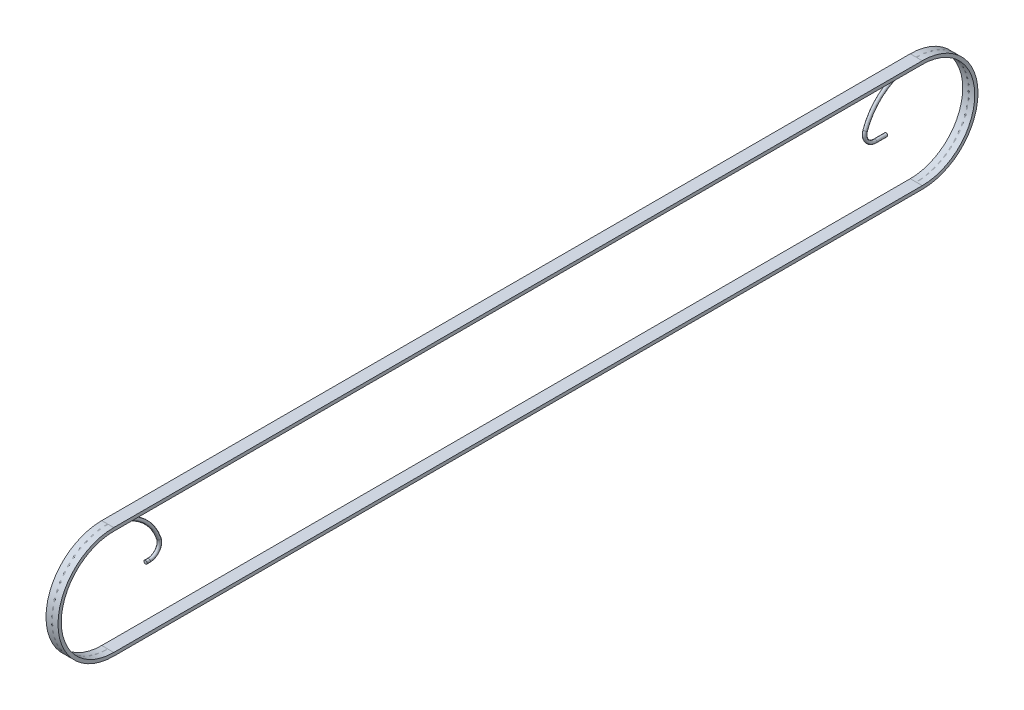
ISO-10303-21;
HEADER;
FILE_DESCRIPTION(('STEP AP214'),'2;1');
FILE_NAME('part.step','',(''),(''),'','','');
FILE_SCHEMA(('AUTOMOTIVE_DESIGN { 1 0 10303 214 1 1 1 1 }'));
ENDSEC;
DATA;
#1=APPLICATION_CONTEXT('core data for automotive mechanical design processes');
#2=APPLICATION_PROTOCOL_DEFINITION('international standard','automotive_design',2000,#1);
#3=PRODUCT_CONTEXT('',#1,'mechanical');
#4=PRODUCT('Part','Part','',(#3));
#5=PRODUCT_RELATED_PRODUCT_CATEGORY('part','',(#4));
#6=PRODUCT_DEFINITION_FORMATION('','',#4);
#7=PRODUCT_DEFINITION_CONTEXT('part definition',#1,'design');
#8=PRODUCT_DEFINITION('design','',#6,#7);
#9=PRODUCT_DEFINITION_SHAPE('','',#8);
#10=(LENGTH_UNIT() NAMED_UNIT(*) SI_UNIT(.MILLI.,.METRE.));
#11=(NAMED_UNIT(*) PLANE_ANGLE_UNIT() SI_UNIT($,.RADIAN.));
#12=(NAMED_UNIT(*) SI_UNIT($,.STERADIAN.) SOLID_ANGLE_UNIT());
#13=UNCERTAINTY_MEASURE_WITH_UNIT(LENGTH_MEASURE(1.E-05),#10,'distance_accuracy_value','');
#14=(GEOMETRIC_REPRESENTATION_CONTEXT(3) GLOBAL_UNCERTAINTY_ASSIGNED_CONTEXT((#13)) GLOBAL_UNIT_ASSIGNED_CONTEXT((#10,
#11,#12)) REPRESENTATION_CONTEXT('',''));
#15=CARTESIAN_POINT('',(0.,0.,0.));
#16=DIRECTION('',(0.,0.,1.));
#17=DIRECTION('',(1.,0.,0.));
#18=AXIS2_PLACEMENT_3D('',#15,#16,#17);
#19=CARTESIAN_POINT('',(0.,5.55624999999999,-54.8438443036897));
#20=DIRECTION('',(0.,0.,-1.));
#21=DIRECTION('',(-1.,0.,0.));
#22=AXIS2_PLACEMENT_3D('',#19,#20,#21);
#23=PLANE('',#22);
#24=CARTESIAN_POINT('',(0.,5.55624999999999,-54.8438443036897));
#25=DIRECTION('',(0.,0.,-1.));
#26=DIRECTION('',(-1.,0.,0.));
#27=AXIS2_PLACEMENT_3D('',#24,#25,#26);
#28=CIRCLE('',#27,2.38125);
#29=CARTESIAN_POINT('',(-2.38125,5.55624999999999,-54.8438443036897));
#30=VERTEX_POINT('',#29);
#31=EDGE_CURVE('E75',#30,#30,#28,.T.);
#32=ORIENTED_EDGE('',*,*,#31,.F.);
#33=EDGE_LOOP('',(#32));
#34=FACE_BOUND('',#33,.T.);
#35=ADVANCED_FACE('F63',(#34),#23,.F.);
#36=CARTESIAN_POINT('',(0.,5.55625,-1130.87336033031));
#37=DIRECTION('',(0.,0.,-1.));
#38=DIRECTION('',(-1.,0.,0.));
#39=AXIS2_PLACEMENT_3D('',#36,#37,#38);
#40=PLANE('',#39);
#41=CARTESIAN_POINT('',(0.,5.55625,-1130.87336033031));
#42=DIRECTION('',(0.,0.,-1.));
#43=DIRECTION('',(-1.,0.,0.));
#44=AXIS2_PLACEMENT_3D('',#41,#42,#43);
#45=CIRCLE('',#44,2.38125);
#46=CARTESIAN_POINT('',(-2.38125,5.55625,-1130.87336033031));
#47=VERTEX_POINT('',#46);
#48=EDGE_CURVE('E13',#47,#47,#45,.T.);
#49=ORIENTED_EDGE('',*,*,#48,.T.);
#50=EDGE_LOOP('',(#49));
#51=FACE_BOUND('',#50,.T.);
#52=ADVANCED_FACE('F78',(#51),#40,.T.);
#53=CARTESIAN_POINT('',(0.,5.55624999999999,-54.8438443036897));
#54=DIRECTION('',(0.,0.,-1.));
#55=DIRECTION('',(0.,1.,0.));
#56=AXIS2_PLACEMENT_3D('',#53,#54,#55);
#57=CYLINDRICAL_SURFACE('',#56,2.38125);
#58=CARTESIAN_POINT('',(0.,5.55625,-59.6063443036897));
#59=DIRECTION('',(0.,0.,-1.));
#60=DIRECTION('',(-1.,0.,0.));
#61=AXIS2_PLACEMENT_3D('',#58,#59,#60);
#62=CIRCLE('',#61,2.38125);
#63=CARTESIAN_POINT('',(0.,3.17499999999997,-59.6063443036897));
#64=VERTEX_POINT('',#63);
#65=EDGE_CURVE('E101',#64,#64,#62,.T.);
#66=ORIENTED_EDGE('',*,*,#65,.F.);
#67=EDGE_LOOP('',(#66));
#68=FACE_BOUND('',#67,.T.);
#69=ORIENTED_EDGE('',*,*,#31,.T.);
#70=EDGE_LOOP('',(#69));
#71=FACE_BOUND('',#70,.T.);
#72=ADVANCED_FACE('F105',(#68,#71),#57,.T.);
#73=CARTESIAN_POINT('',(0.,20.955,-59.6063443036897));
#74=DIRECTION('',(1.,0.,0.));
#75=DIRECTION('',(0.,0.,-1.));
#76=AXIS2_PLACEMENT_3D('',#73,#74,#75);
#77=TOROIDAL_SURFACE('',#76,15.39875,2.38125);
#78=CARTESIAN_POINT('',(0.,26.0621231155779,-74.1335186691618));
#79=DIRECTION('',(0.,0.943399585386613,0.331658291457286));
#80=DIRECTION('',(-1.,0.,0.));
#81=AXIS2_PLACEMENT_3D('',#78,#79,#80);
#82=CIRCLE('',#81,2.38125);
#83=CARTESIAN_POINT('',(0.,26.8518844221106,-76.3799889318637));
#84=VERTEX_POINT('',#83);
#85=EDGE_CURVE('E98',#84,#84,#82,.T.);
#86=CARTESIAN_POINT('',(0.,20.955,-59.6063443036897));
#87=DIRECTION('',(1.,0.,0.));
#88=DIRECTION('',(0.,0.,-1.));
#89=AXIS2_PLACEMENT_3D('',#86,#87,#88);
#90=CIRCLE('',#89,17.78);
#91=EDGE_CURVE('',#64,#84,#90,.T.);
#92=ORIENTED_EDGE('',*,*,#65,.T.);
#93=ORIENTED_EDGE('',*,*,#85,.F.);
#94=ORIENTED_EDGE('',*,*,#91,.T.);
#95=ORIENTED_EDGE('',*,*,#91,.F.);
#96=EDGE_LOOP('',(#92,#94,#93,#95));
#97=FACE_BOUND('',#96,.T.);
#98=ADVANCED_FACE('F107',(#97),#77,.T.);
#99=CARTESIAN_POINT('',(0.,0.,0.));
#100=DIRECTION('',(1.,0.,0.));
#101=DIRECTION('',(0.,0.,-1.));
#102=AXIS2_PLACEMENT_3D('',#99,#100,#101);
#103=TOROIDAL_SURFACE('',#102,78.58125,2.38125);
#104=CARTESIAN_POINT('',(0.,-78.58125,0.));
#105=DIRECTION('',(0.,0.,-1.));
#106=DIRECTION('',(-1.,0.,0.));
#107=AXIS2_PLACEMENT_3D('',#104,#105,#106);
#108=CIRCLE('',#107,2.38125);
#109=CARTESIAN_POINT('',(0.,-80.9625,0.));
#110=VERTEX_POINT('',#109);
#111=EDGE_CURVE('E95',#110,#110,#108,.T.);
#112=CARTESIAN_POINT('',(0.,0.,0.));
#113=DIRECTION('',(1.,0.,0.));
#114=DIRECTION('',(0.,0.,-1.));
#115=AXIS2_PLACEMENT_3D('',#112,#113,#114);
#116=CIRCLE('',#115,80.9625);
#117=EDGE_CURVE('',#84,#110,#116,.T.);
#118=ORIENTED_EDGE('',*,*,#85,.T.);
#119=ORIENTED_EDGE('',*,*,#111,.F.);
#120=ORIENTED_EDGE('',*,*,#117,.T.);
#121=ORIENTED_EDGE('',*,*,#117,.F.);
#122=EDGE_LOOP('',(#118,#120,#119,#121));
#123=FACE_BOUND('',#122,.T.);
#124=ADVANCED_FACE('F114',(#123),#103,.T.);
#125=CARTESIAN_POINT('',(0.,-78.58125,0.));
#126=DIRECTION('',(0.,0.,-1.));
#127=DIRECTION('',(-1.,0.,0.));
#128=AXIS2_PLACEMENT_3D('',#125,#126,#127);
#129=CYLINDRICAL_SURFACE('',#128,2.38125);
#130=CARTESIAN_POINT('',(0.,-78.58125,-1174.668204634));
#131=DIRECTION('',(0.,0.,-1.));
#132=DIRECTION('',(-1.,0.,0.));
#133=AXIS2_PLACEMENT_3D('',#130,#131,#132);
#134=CIRCLE('',#133,2.38125);
#135=CARTESIAN_POINT('',(0.,-80.9625,-1174.668204634));
#136=VERTEX_POINT('',#135);
#137=EDGE_CURVE('E90',#136,#136,#134,.T.);
#138=ORIENTED_EDGE('',*,*,#137,.F.);
#139=EDGE_LOOP('',(#138));
#140=FACE_BOUND('',#139,.T.);
#141=ORIENTED_EDGE('',*,*,#111,.T.);
#142=EDGE_LOOP('',(#141));
#143=FACE_BOUND('',#142,.T.);
#144=ADVANCED_FACE('F121',(#140,#143),#129,.T.);
#145=CARTESIAN_POINT('',(0.,0.,-1174.668204634));
#146=DIRECTION('',(1.,0.,0.));
#147=DIRECTION('',(0.,0.,-1.));
#148=AXIS2_PLACEMENT_3D('',#145,#146,#147);
#149=TOROIDAL_SURFACE('',#148,78.58125,2.38125);
#150=CARTESIAN_POINT('',(0.,26.0621231155778,-1100.53468596484));
#151=DIRECTION('',(0.,-0.943399585386614,0.331658291457286));
#152=DIRECTION('',(-1.,0.,0.));
#153=AXIS2_PLACEMENT_3D('',#150,#151,#152);
#154=CIRCLE('',#153,2.38125);
#155=CARTESIAN_POINT('',(0.,26.8518844221104,-1098.28821570214));
#156=VERTEX_POINT('',#155);
#157=EDGE_CURVE('E88',#156,#156,#154,.T.);
#158=CARTESIAN_POINT('',(0.,0.,-1174.668204634));
#159=DIRECTION('',(1.,0.,0.));
#160=DIRECTION('',(0.,0.,-1.));
#161=AXIS2_PLACEMENT_3D('',#158,#159,#160);
#162=CIRCLE('',#161,80.9625);
#163=EDGE_CURVE('',#136,#156,#162,.T.);
#164=ORIENTED_EDGE('',*,*,#137,.T.);
#165=ORIENTED_EDGE('',*,*,#157,.F.);
#166=ORIENTED_EDGE('',*,*,#163,.T.);
#167=ORIENTED_EDGE('',*,*,#163,.F.);
#168=EDGE_LOOP('',(#164,#166,#165,#167));
#169=FACE_BOUND('',#168,.T.);
#170=ADVANCED_FACE('F125',(#169),#149,.T.);
#171=CARTESIAN_POINT('',(0.,20.955,-1115.06186033031));
#172=DIRECTION('',(1.,0.,0.));
#173=DIRECTION('',(0.,0.,-1.));
#174=AXIS2_PLACEMENT_3D('',#171,#172,#173);
#175=TOROIDAL_SURFACE('',#174,15.3987500000001,2.38125);
#176=CARTESIAN_POINT('',(0.,5.55624999999995,-1115.06186033031));
#177=DIRECTION('',(0.,0.,-1.));
#178=DIRECTION('',(-1.,0.,0.));
#179=AXIS2_PLACEMENT_3D('',#176,#177,#178);
#180=CIRCLE('',#179,2.38125);
#181=CARTESIAN_POINT('',(0.,3.17499999999988,-1115.06186033031));
#182=VERTEX_POINT('',#181);
#183=EDGE_CURVE('E70',#182,#182,#180,.T.);
#184=CARTESIAN_POINT('',(0.,20.955,-1115.06186033031));
#185=DIRECTION('',(1.,0.,0.));
#186=DIRECTION('',(0.,0.,-1.));
#187=AXIS2_PLACEMENT_3D('',#184,#185,#186);
#188=CIRCLE('',#187,17.7800000000001);
#189=EDGE_CURVE('',#156,#182,#188,.T.);
#190=ORIENTED_EDGE('',*,*,#157,.T.);
#191=ORIENTED_EDGE('',*,*,#183,.F.);
#192=ORIENTED_EDGE('',*,*,#189,.T.);
#193=ORIENTED_EDGE('',*,*,#189,.F.);
#194=EDGE_LOOP('',(#190,#192,#191,#193));
#195=FACE_BOUND('',#194,.T.);
#196=ADVANCED_FACE('F83',(#195),#175,.T.);
#197=CARTESIAN_POINT('',(0.,5.55625,-1115.06186033031));
#198=DIRECTION('',(0.,0.,-1.));
#199=DIRECTION('',(0.,1.,0.));
#200=AXIS2_PLACEMENT_3D('',#197,#198,#199);
#201=CYLINDRICAL_SURFACE('',#200,2.38125);
#202=ORIENTED_EDGE('',*,*,#48,.F.);
#203=EDGE_LOOP('',(#202));
#204=FACE_BOUND('',#203,.T.);
#205=ORIENTED_EDGE('',*,*,#183,.T.);
#206=EDGE_LOOP('',(#205));
#207=FACE_BOUND('',#206,.T.);
#208=ADVANCED_FACE('F80',(#204,#207),#201,.T.);
#209=CLOSED_SHELL('',(#35,#52,#72,#98,#124,#144,#170,#196,#208));
#210=MANIFOLD_SOLID_BREP('B2',#209);
#211=CARTESIAN_POINT('',(8.73125,0.,0.));
#212=DIRECTION('',(1.,0.,0.));
#213=DIRECTION('',(0.,0.,-1.));
#214=AXIS2_PLACEMENT_3D('',#211,#212,#213);
#215=PLANE('',#214);
#216=CARTESIAN_POINT('',(8.73125,0.,0.));
#217=DIRECTION('',(1.,0.,0.));
#218=DIRECTION('',(0.,0.,-1.));
#219=AXIS2_PLACEMENT_3D('',#216,#217,#218);
#220=CIRCLE('',#219,80.9625);
#221=CARTESIAN_POINT('',(8.73125,80.9625,0.));
#222=VERTEX_POINT('',#221);
#223=CARTESIAN_POINT('',(8.73125,-80.9625,0.));
#224=VERTEX_POINT('',#223);
#225=EDGE_CURVE('E297',#222,#224,#220,.T.);
#226=ORIENTED_EDGE('',*,*,#225,.T.);
#227=DIRECTION('',(0.,0.,-1.));
#228=VECTOR('',#227,1.);
#229=CARTESIAN_POINT('',(8.73125,-80.9625,0.));
#230=LINE('',#229,#228);
#231=CARTESIAN_POINT('',(8.73125,-80.9625,-1174.668204634));
#232=VERTEX_POINT('',#231);
#233=EDGE_CURVE('E300',#224,#232,#230,.T.);
#234=ORIENTED_EDGE('',*,*,#233,.T.);
#235=CARTESIAN_POINT('',(8.73125,0.,-1174.668204634));
#236=DIRECTION('',(1.,0.,0.));
#237=DIRECTION('',(0.,0.,1.));
#238=AXIS2_PLACEMENT_3D('',#235,#236,#237);
#239=CIRCLE('',#238,80.9625);
#240=CARTESIAN_POINT('',(8.73125,80.9625,-1174.668204634));
#241=VERTEX_POINT('',#240);
#242=EDGE_CURVE('E303',#232,#241,#239,.T.);
#243=ORIENTED_EDGE('',*,*,#242,.T.);
#244=DIRECTION('',(0.,0.,1.));
#245=VECTOR('',#244,1.);
#246=CARTESIAN_POINT('',(8.73125,80.9625,0.));
#247=LINE('',#246,#245);
#248=EDGE_CURVE('E305',#241,#222,#247,.T.);
#249=ORIENTED_EDGE('',*,*,#248,.T.);
#250=EDGE_LOOP('',(#226,#234,#243,#249));
#251=FACE_BOUND('',#250,.T.);
#252=DIRECTION('',(0.,0.,1.));
#253=VECTOR('',#252,1.);
#254=CARTESIAN_POINT('',(8.73125,76.1999999999998,-1174.668204634));
#255=LINE('',#254,#253);
#256=CARTESIAN_POINT('',(8.73125,76.1999999999998,-1174.668204634));
#257=VERTEX_POINT('',#256);
#258=CARTESIAN_POINT('',(8.73125,76.2,0.));
#259=VERTEX_POINT('',#258);
#260=EDGE_CURVE('E269',#257,#259,#255,.T.);
#261=ORIENTED_EDGE('',*,*,#260,.F.);
#262=CARTESIAN_POINT('',(8.73125,0.,-1174.668204634));
#263=DIRECTION('',(1.,0.,0.));
#264=DIRECTION('',(0.,0.,-1.));
#265=AXIS2_PLACEMENT_3D('',#262,#263,#264);
#266=CIRCLE('',#265,76.1999999999998);
#267=CARTESIAN_POINT('',(8.73125,-76.1999999999998,-1174.668204634));
#268=VERTEX_POINT('',#267);
#269=EDGE_CURVE('E261',#268,#257,#266,.T.);
#270=ORIENTED_EDGE('',*,*,#269,.F.);
#271=DIRECTION('',(0.,0.,-1.));
#272=VECTOR('',#271,1.);
#273=CARTESIAN_POINT('',(8.73125,-76.1999999999998,-1174.668204634));
#274=LINE('',#273,#272);
#275=CARTESIAN_POINT('',(8.73125,-76.2,0.));
#276=VERTEX_POINT('',#275);
#277=EDGE_CURVE('E283',#276,#268,#274,.T.);
#278=ORIENTED_EDGE('',*,*,#277,.F.);
#279=CARTESIAN_POINT('',(8.73125,0.,0.));
#280=DIRECTION('',(1.,0.,0.));
#281=DIRECTION('',(0.,0.,-1.));
#282=AXIS2_PLACEMENT_3D('',#279,#280,#281);
#283=CIRCLE('',#282,76.2);
#284=EDGE_CURVE('E281',#259,#276,#283,.T.);
#285=ORIENTED_EDGE('',*,*,#284,.F.);
#286=EDGE_LOOP('',(#261,#270,#278,#285));
#287=FACE_BOUND('',#286,.T.);
#288=ADVANCED_FACE('F196',(#251,#287),#215,.T.);
#289=CARTESIAN_POINT('',(-8.73125,0.,0.));
#290=DIRECTION('',(1.,0.,0.));
#291=DIRECTION('',(0.,0.,-1.));
#292=AXIS2_PLACEMENT_3D('',#289,#290,#291);
#293=PLANE('',#292);
#294=CARTESIAN_POINT('',(-8.73125,0.,0.));
#295=DIRECTION('',(1.,0.,0.));
#296=DIRECTION('',(0.,0.,-1.));
#297=AXIS2_PLACEMENT_3D('',#294,#295,#296);
#298=CIRCLE('',#297,80.9625);
#299=CARTESIAN_POINT('',(-8.73125,80.9625,0.));
#300=VERTEX_POINT('',#299);
#301=CARTESIAN_POINT('',(-8.73125,-80.9625,0.));
#302=VERTEX_POINT('',#301);
#303=EDGE_CURVE('E277',#300,#302,#298,.T.);
#304=ORIENTED_EDGE('',*,*,#303,.F.);
#305=DIRECTION('',(0.,0.,1.));
#306=VECTOR('',#305,1.);
#307=CARTESIAN_POINT('',(-8.73125,80.9625,0.));
#308=LINE('',#307,#306);
#309=CARTESIAN_POINT('',(-8.73125,80.9625,-1174.668204634));
#310=VERTEX_POINT('',#309);
#311=EDGE_CURVE('E301',#310,#300,#308,.T.);
#312=ORIENTED_EDGE('',*,*,#311,.F.);
#313=CARTESIAN_POINT('',(-8.73125,0.,-1174.668204634));
#314=DIRECTION('',(1.,0.,0.));
#315=DIRECTION('',(0.,0.,1.));
#316=AXIS2_PLACEMENT_3D('',#313,#314,#315);
#317=CIRCLE('',#316,80.9625);
#318=CARTESIAN_POINT('',(-8.73125,-80.9625,-1174.668204634));
#319=VERTEX_POINT('',#318);
#320=EDGE_CURVE('E312',#319,#310,#317,.T.);
#321=ORIENTED_EDGE('',*,*,#320,.F.);
#322=DIRECTION('',(0.,0.,-1.));
#323=VECTOR('',#322,1.);
#324=CARTESIAN_POINT('',(-8.73125,-80.9625,0.));
#325=LINE('',#324,#323);
#326=EDGE_CURVE('E310',#302,#319,#325,.T.);
#327=ORIENTED_EDGE('',*,*,#326,.F.);
#328=EDGE_LOOP('',(#304,#312,#321,#327));
#329=FACE_BOUND('',#328,.T.);
#330=CARTESIAN_POINT('',(-8.73125,0.,-1174.668204634));
#331=DIRECTION('',(1.,0.,0.));
#332=DIRECTION('',(0.,0.,-1.));
#333=AXIS2_PLACEMENT_3D('',#330,#331,#332);
#334=CIRCLE('',#333,76.1999999999998);
#335=CARTESIAN_POINT('',(-8.73125,-76.1999999999998,-1174.668204634));
#336=VERTEX_POINT('',#335);
#337=CARTESIAN_POINT('',(-8.73125,76.1999999999998,-1174.668204634));
#338=VERTEX_POINT('',#337);
#339=EDGE_CURVE('E219',#336,#338,#334,.T.);
#340=ORIENTED_EDGE('',*,*,#339,.T.);
#341=DIRECTION('',(0.,0.,1.));
#342=VECTOR('',#341,1.);
#343=CARTESIAN_POINT('',(-8.73125,76.1999999999998,-1174.668204634));
#344=LINE('',#343,#342);
#345=CARTESIAN_POINT('',(-8.73125,76.2,0.));
#346=VERTEX_POINT('',#345);
#347=EDGE_CURVE('E276',#338,#346,#344,.T.);
#348=ORIENTED_EDGE('',*,*,#347,.T.);
#349=CARTESIAN_POINT('',(-8.73125,0.,0.));
#350=DIRECTION('',(1.,0.,0.));
#351=DIRECTION('',(0.,0.,-1.));
#352=AXIS2_PLACEMENT_3D('',#349,#350,#351);
#353=CIRCLE('',#352,76.2);
#354=CARTESIAN_POINT('',(-8.73125,-76.2,0.));
#355=VERTEX_POINT('',#354);
#356=EDGE_CURVE('E289',#346,#355,#353,.T.);
#357=ORIENTED_EDGE('',*,*,#356,.T.);
#358=DIRECTION('',(0.,0.,-1.));
#359=VECTOR('',#358,1.);
#360=CARTESIAN_POINT('',(-8.73125,-76.1999999999998,-1174.668204634));
#361=LINE('',#360,#359);
#362=EDGE_CURVE('E270',#355,#336,#361,.T.);
#363=ORIENTED_EDGE('',*,*,#362,.T.);
#364=EDGE_LOOP('',(#340,#348,#357,#363));
#365=FACE_BOUND('',#364,.T.);
#366=ADVANCED_FACE('F330',(#329,#365),#293,.F.);
#367=CARTESIAN_POINT('',(8.73125,0.,0.));
#368=DIRECTION('',(-1.,0.,0.));
#369=DIRECTION('',(0.,0.,1.));
#370=AXIS2_PLACEMENT_3D('',#367,#368,#369);
#371=CYLINDRICAL_SURFACE('',#370,80.9625);
#372=ORIENTED_EDGE('',*,*,#303,.T.);
#373=DIRECTION('',(-1.,0.,0.));
#374=VECTOR('',#373,1.);
#375=CARTESIAN_POINT('',(8.73125,-80.9625,0.));
#376=LINE('',#375,#374);
#377=EDGE_CURVE('E61',#224,#302,#376,.T.);
#378=ORIENTED_EDGE('',*,*,#377,.F.);
#379=ORIENTED_EDGE('',*,*,#225,.F.);
#380=DIRECTION('',(-1.,0.,0.));
#381=VECTOR('',#380,1.);
#382=CARTESIAN_POINT('',(8.73125,80.9625,0.));
#383=LINE('',#382,#381);
#384=EDGE_CURVE('E307',#222,#300,#383,.T.);
#385=ORIENTED_EDGE('',*,*,#384,.T.);
#386=EDGE_LOOP('',(#372,#378,#379,#385));
#387=FACE_BOUND('',#386,.T.);
#388=ADVANCED_FACE('F198',(#387),#371,.T.);
#389=CARTESIAN_POINT('',(8.73125,-80.9625,0.));
#390=DIRECTION('',(0.,1.,0.));
#391=DIRECTION('',(0.,0.,1.));
#392=AXIS2_PLACEMENT_3D('',#389,#390,#391);
#393=PLANE('',#392);
#394=ORIENTED_EDGE('',*,*,#326,.T.);
#395=DIRECTION('',(-1.,0.,0.));
#396=VECTOR('',#395,1.);
#397=CARTESIAN_POINT('',(8.73125,-80.9625,-1174.668204634));
#398=LINE('',#397,#396);
#399=EDGE_CURVE('E204',#232,#319,#398,.T.);
#400=ORIENTED_EDGE('',*,*,#399,.F.);
#401=ORIENTED_EDGE('',*,*,#233,.F.);
#402=ORIENTED_EDGE('',*,*,#377,.T.);
#403=EDGE_LOOP('',(#394,#400,#401,#402));
#404=FACE_BOUND('',#403,.T.);
#405=ADVANCED_FACE('F340',(#404),#393,.F.);
#406=CARTESIAN_POINT('',(8.73125,0.,-1174.668204634));
#407=DIRECTION('',(-1.,0.,0.));
#408=DIRECTION('',(0.,0.,1.));
#409=AXIS2_PLACEMENT_3D('',#406,#407,#408);
#410=CYLINDRICAL_SURFACE('',#409,80.9625);
#411=ORIENTED_EDGE('',*,*,#320,.T.);
#412=DIRECTION('',(-1.,0.,0.));
#413=VECTOR('',#412,1.);
#414=CARTESIAN_POINT('',(8.73125,80.9625,-1174.668204634));
#415=LINE('',#414,#413);
#416=EDGE_CURVE('E317',#241,#310,#415,.T.);
#417=ORIENTED_EDGE('',*,*,#416,.F.);
#418=ORIENTED_EDGE('',*,*,#242,.F.);
#419=ORIENTED_EDGE('',*,*,#399,.T.);
#420=EDGE_LOOP('',(#411,#417,#418,#419));
#421=FACE_BOUND('',#420,.T.);
#422=ADVANCED_FACE('F324',(#421),#410,.T.);
#423=CARTESIAN_POINT('',(8.73125,80.9625,0.));
#424=DIRECTION('',(0.,-1.,0.));
#425=DIRECTION('',(0.,0.,-1.));
#426=AXIS2_PLACEMENT_3D('',#423,#424,#425);
#427=PLANE('',#426);
#428=ORIENTED_EDGE('',*,*,#311,.T.);
#429=ORIENTED_EDGE('',*,*,#384,.F.);
#430=ORIENTED_EDGE('',*,*,#248,.F.);
#431=ORIENTED_EDGE('',*,*,#416,.T.);
#432=EDGE_LOOP('',(#428,#429,#430,#431));
#433=FACE_BOUND('',#432,.T.);
#434=ADVANCED_FACE('F334',(#433),#427,.F.);
#435=CARTESIAN_POINT('',(8.73125,0.,-1174.668204634));
#436=DIRECTION('',(-1.,0.,0.));
#437=DIRECTION('',(0.,0.,1.));
#438=AXIS2_PLACEMENT_3D('',#435,#436,#437);
#439=CYLINDRICAL_SURFACE('',#438,76.1999999999998);
#440=ORIENTED_EDGE('',*,*,#339,.F.);
#441=DIRECTION('',(-1.,0.,0.));
#442=VECTOR('',#441,1.);
#443=CARTESIAN_POINT('',(8.73125,-76.1999999999998,-1174.668204634));
#444=LINE('',#443,#442);
#445=EDGE_CURVE('E265',#268,#336,#444,.T.);
#446=ORIENTED_EDGE('',*,*,#445,.F.);
#447=ORIENTED_EDGE('',*,*,#269,.T.);
#448=DIRECTION('',(-1.,0.,0.));
#449=VECTOR('',#448,1.);
#450=CARTESIAN_POINT('',(8.73125,76.1999999999998,-1174.668204634));
#451=LINE('',#450,#449);
#452=EDGE_CURVE('E264',#257,#338,#451,.T.);
#453=ORIENTED_EDGE('',*,*,#452,.T.);
#454=EDGE_LOOP('',(#440,#446,#447,#453));
#455=FACE_BOUND('',#454,.T.);
#456=ADVANCED_FACE('F263',(#455),#439,.F.);
#457=CARTESIAN_POINT('',(8.73125,76.1999999999998,-1174.668204634));
#458=DIRECTION('',(0.,-1.,0.));
#459=DIRECTION('',(0.,0.,-1.));
#460=AXIS2_PLACEMENT_3D('',#457,#458,#459);
#461=PLANE('',#460);
#462=ORIENTED_EDGE('',*,*,#347,.F.);
#463=ORIENTED_EDGE('',*,*,#452,.F.);
#464=ORIENTED_EDGE('',*,*,#260,.T.);
#465=DIRECTION('',(-1.,0.,0.));
#466=VECTOR('',#465,1.);
#467=CARTESIAN_POINT('',(8.73125,76.2,0.));
#468=LINE('',#467,#466);
#469=EDGE_CURVE('E278',#259,#346,#468,.T.);
#470=ORIENTED_EDGE('',*,*,#469,.T.);
#471=EDGE_LOOP('',(#462,#463,#464,#470));
#472=FACE_BOUND('',#471,.T.);
#473=ADVANCED_FACE('F273',(#472),#461,.T.);
#474=CARTESIAN_POINT('',(8.73125,0.,0.));
#475=DIRECTION('',(-1.,0.,0.));
#476=DIRECTION('',(0.,0.,1.));
#477=AXIS2_PLACEMENT_3D('',#474,#475,#476);
#478=CYLINDRICAL_SURFACE('',#477,76.2);
#479=ORIENTED_EDGE('',*,*,#356,.F.);
#480=ORIENTED_EDGE('',*,*,#469,.F.);
#481=ORIENTED_EDGE('',*,*,#284,.T.);
#482=DIRECTION('',(-1.,0.,0.));
#483=VECTOR('',#482,1.);
#484=CARTESIAN_POINT('',(8.73125,-76.2,0.));
#485=LINE('',#484,#483);
#486=EDGE_CURVE('E211',#276,#355,#485,.T.);
#487=ORIENTED_EDGE('',*,*,#486,.T.);
#488=EDGE_LOOP('',(#479,#480,#481,#487));
#489=FACE_BOUND('',#488,.T.);
#490=ADVANCED_FACE('F363',(#489),#478,.F.);
#491=CARTESIAN_POINT('',(8.73125,-76.1999999999998,-1174.668204634));
#492=DIRECTION('',(0.,1.,0.));
#493=DIRECTION('',(0.,0.,1.));
#494=AXIS2_PLACEMENT_3D('',#491,#492,#493);
#495=PLANE('',#494);
#496=ORIENTED_EDGE('',*,*,#362,.F.);
#497=ORIENTED_EDGE('',*,*,#486,.F.);
#498=ORIENTED_EDGE('',*,*,#277,.T.);
#499=ORIENTED_EDGE('',*,*,#445,.T.);
#500=EDGE_LOOP('',(#496,#497,#498,#499));
#501=FACE_BOUND('',#500,.T.);
#502=ADVANCED_FACE('F367',(#501),#495,.T.);
#503=CLOSED_SHELL('',(#288,#366,#388,#405,#422,#434,#456,#473,#490,#502));
#504=MANIFOLD_SOLID_BREP('B7_NOT_SHOWN',#503);
#505=ADVANCED_BREP_SHAPE_REPRESENTATION('',(#18,#210,#504),#14);
#506=SHAPE_DEFINITION_REPRESENTATION(#9,#505);
ENDSEC;
END-ISO-10303-21;
